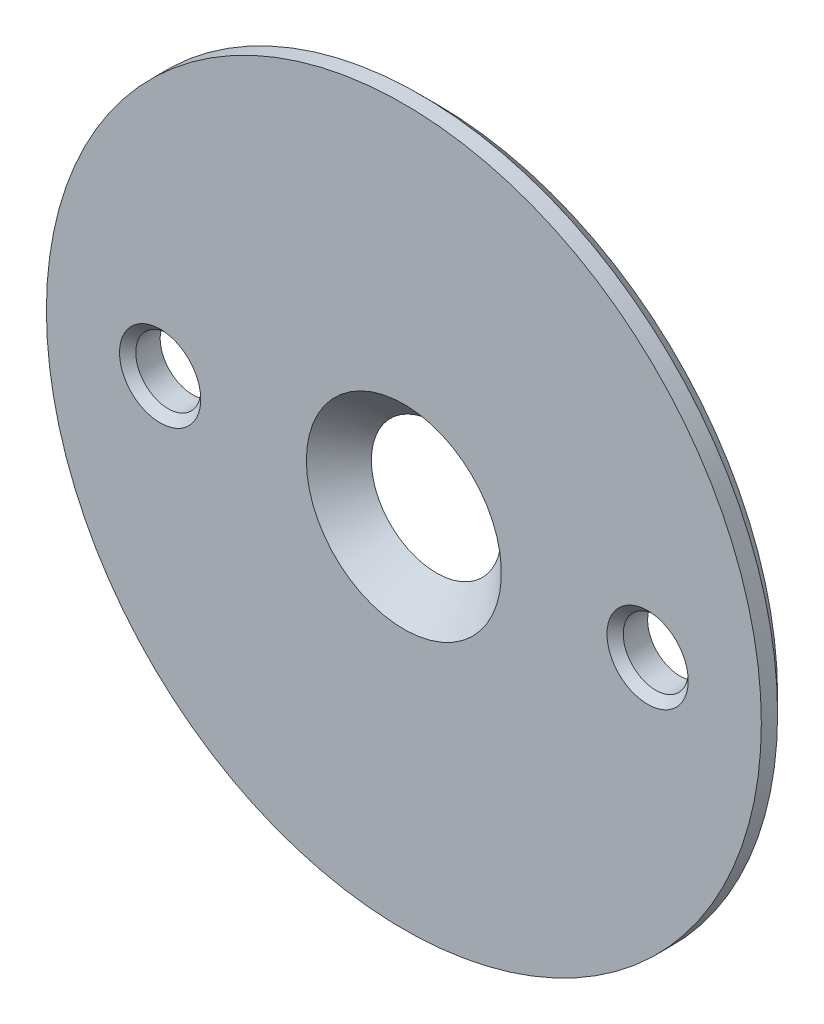
ISO-10303-21;
HEADER;
FILE_DESCRIPTION(('STEP AP214'),'2;1');
FILE_NAME('part.step','',(''),(''),'','','');
FILE_SCHEMA(('AUTOMOTIVE_DESIGN { 1 0 10303 214 1 1 1 1 }'));
ENDSEC;
DATA;
#1=APPLICATION_CONTEXT('core data for automotive mechanical design processes');
#2=APPLICATION_PROTOCOL_DEFINITION('international standard','automotive_design',2000,#1);
#3=PRODUCT_CONTEXT('',#1,'mechanical');
#4=PRODUCT('Part','Part','',(#3));
#5=PRODUCT_RELATED_PRODUCT_CATEGORY('part','',(#4));
#6=PRODUCT_DEFINITION_FORMATION('','',#4);
#7=PRODUCT_DEFINITION_CONTEXT('part definition',#1,'design');
#8=PRODUCT_DEFINITION('design','',#6,#7);
#9=PRODUCT_DEFINITION_SHAPE('','',#8);
#10=(LENGTH_UNIT() NAMED_UNIT(*) SI_UNIT(.MILLI.,.METRE.));
#11=(NAMED_UNIT(*) PLANE_ANGLE_UNIT() SI_UNIT($,.RADIAN.));
#12=(NAMED_UNIT(*) SI_UNIT($,.STERADIAN.) SOLID_ANGLE_UNIT());
#13=UNCERTAINTY_MEASURE_WITH_UNIT(LENGTH_MEASURE(1.E-05),#10,'distance_accuracy_value','');
#14=(GEOMETRIC_REPRESENTATION_CONTEXT(3) GLOBAL_UNCERTAINTY_ASSIGNED_CONTEXT((#13)) GLOBAL_UNIT_ASSIGNED_CONTEXT((#10,
#11,#12)) REPRESENTATION_CONTEXT('',''));
#15=CARTESIAN_POINT('',(0.,0.,0.));
#16=DIRECTION('',(0.,0.,1.));
#17=DIRECTION('',(1.,0.,0.));
#18=AXIS2_PLACEMENT_3D('',#15,#16,#17);
#19=CARTESIAN_POINT('',(0.,0.,2.));
#20=DIRECTION('',(0.,0.,-1.));
#21=DIRECTION('',(0.,-1.,0.));
#22=AXIS2_PLACEMENT_3D('',#19,#20,#21);
#23=PLANE('',#22);
#24=CARTESIAN_POINT('',(-15.,0.,2.));
#25=DIRECTION('',(0.,0.,-1.));
#26=DIRECTION('',(1.,0.,0.));
#27=AXIS2_PLACEMENT_3D('',#24,#25,#26);
#28=CIRCLE('',#27,2.5);
#29=CARTESIAN_POINT('',(-17.5,0.,2.));
#30=VERTEX_POINT('',#29);
#31=EDGE_CURVE('E118',#30,#30,#28,.T.);
#32=ORIENTED_EDGE('',*,*,#31,.T.);
#33=EDGE_LOOP('',(#32));
#34=FACE_BOUND('',#33,.T.);
#35=CARTESIAN_POINT('',(15.,0.,2.));
#36=DIRECTION('',(0.,0.,-1.));
#37=DIRECTION('',(1.,0.,0.));
#38=AXIS2_PLACEMENT_3D('',#35,#36,#37);
#39=CIRCLE('',#38,2.5);
#40=CARTESIAN_POINT('',(12.5,0.,2.));
#41=VERTEX_POINT('',#40);
#42=EDGE_CURVE('E126',#41,#41,#39,.T.);
#43=ORIENTED_EDGE('',*,*,#42,.T.);
#44=EDGE_LOOP('',(#43));
#45=FACE_BOUND('',#44,.T.);
#46=CARTESIAN_POINT('',(0.,0.,2.));
#47=DIRECTION('',(0.,0.,-1.));
#48=DIRECTION('',(1.,0.,0.));
#49=AXIS2_PLACEMENT_3D('',#46,#47,#48);
#50=CIRCLE('',#49,6.);
#51=CARTESIAN_POINT('',(-6.,0.,2.));
#52=VERTEX_POINT('',#51);
#53=EDGE_CURVE('E51',#52,#52,#50,.T.);
#54=ORIENTED_EDGE('',*,*,#53,.T.);
#55=EDGE_LOOP('',(#54));
#56=FACE_BOUND('',#55,.T.);
#57=CARTESIAN_POINT('',(0.,0.,2.));
#58=DIRECTION('',(0.,0.,-1.));
#59=DIRECTION('',(-1.,0.,0.));
#60=AXIS2_PLACEMENT_3D('',#57,#58,#59);
#61=CIRCLE('',#60,22.);
#62=CARTESIAN_POINT('',(22.,0.,2.));
#63=VERTEX_POINT('',#62);
#64=EDGE_CURVE('E26',#63,#63,#61,.T.);
#65=ORIENTED_EDGE('',*,*,#64,.F.);
#66=EDGE_LOOP('',(#65));
#67=FACE_BOUND('',#66,.T.);
#68=ADVANCED_FACE('F17',(#34,#45,#56,#67),#23,.F.);
#69=CARTESIAN_POINT('',(0.,0.,0.));
#70=DIRECTION('',(0.,0.,-1.));
#71=DIRECTION('',(0.,-1.,0.));
#72=AXIS2_PLACEMENT_3D('',#69,#70,#71);
#73=PLANE('',#72);
#74=CARTESIAN_POINT('',(-15.,0.,0.));
#75=DIRECTION('',(0.,0.,1.));
#76=DIRECTION('',(1.,0.,0.));
#77=AXIS2_PLACEMENT_3D('',#74,#75,#76);
#78=CIRCLE('',#77,2.);
#79=CARTESIAN_POINT('',(-17.,0.,0.));
#80=VERTEX_POINT('',#79);
#81=EDGE_CURVE('E113',#80,#80,#78,.T.);
#82=ORIENTED_EDGE('',*,*,#81,.T.);
#83=EDGE_LOOP('',(#82));
#84=FACE_BOUND('',#83,.T.);
#85=CARTESIAN_POINT('',(15.,0.,0.));
#86=DIRECTION('',(0.,0.,1.));
#87=DIRECTION('',(1.,0.,0.));
#88=AXIS2_PLACEMENT_3D('',#85,#86,#87);
#89=CIRCLE('',#88,2.);
#90=CARTESIAN_POINT('',(13.,0.,0.));
#91=VERTEX_POINT('',#90);
#92=EDGE_CURVE('E129',#91,#91,#89,.T.);
#93=ORIENTED_EDGE('',*,*,#92,.T.);
#94=EDGE_LOOP('',(#93));
#95=FACE_BOUND('',#94,.T.);
#96=CARTESIAN_POINT('',(0.,0.,0.));
#97=DIRECTION('',(0.,0.,1.));
#98=DIRECTION('',(1.,0.,0.));
#99=AXIS2_PLACEMENT_3D('',#96,#97,#98);
#100=CIRCLE('',#99,4.);
#101=CARTESIAN_POINT('',(-4.,0.,0.));
#102=VERTEX_POINT('',#101);
#103=EDGE_CURVE('E169',#102,#102,#100,.T.);
#104=ORIENTED_EDGE('',*,*,#103,.T.);
#105=EDGE_LOOP('',(#104));
#106=FACE_BOUND('',#105,.T.);
#107=CARTESIAN_POINT('',(0.,0.,0.));
#108=DIRECTION('',(0.,0.,1.));
#109=DIRECTION('',(-1.,0.,0.));
#110=AXIS2_PLACEMENT_3D('',#107,#108,#109);
#111=CIRCLE('',#110,21.);
#112=CARTESIAN_POINT('',(21.,0.,0.));
#113=VERTEX_POINT('',#112);
#114=EDGE_CURVE('E99',#113,#113,#111,.T.);
#115=ORIENTED_EDGE('',*,*,#114,.F.);
#116=EDGE_LOOP('',(#115));
#117=FACE_BOUND('',#116,.T.);
#118=ADVANCED_FACE('F219',(#84,#95,#106,#117),#73,.T.);
#119=CARTESIAN_POINT('',(0.,0.,0.));
#120=DIRECTION('',(0.,0.,1.));
#121=DIRECTION('',(-1.,0.,0.));
#122=AXIS2_PLACEMENT_3D('',#119,#120,#121);
#123=CYLINDRICAL_SURFACE('',#122,22.);
#124=ORIENTED_EDGE('',*,*,#64,.T.);
#125=DIRECTION('',(0.,0.,-1.));
#126=VECTOR('',#125,1.);
#127=CARTESIAN_POINT('',(22.,0.,0.));
#128=LINE('',#127,#126);
#129=CARTESIAN_POINT('',(22.,0.,1.));
#130=VERTEX_POINT('',#129);
#131=EDGE_CURVE('E11',#63,#130,#128,.T.);
#132=ORIENTED_EDGE('',*,*,#131,.T.);
#133=CARTESIAN_POINT('',(0.,0.,1.));
#134=DIRECTION('',(0.,0.,-1.));
#135=DIRECTION('',(-1.,0.,0.));
#136=AXIS2_PLACEMENT_3D('',#133,#134,#135);
#137=CIRCLE('',#136,22.);
#138=EDGE_CURVE('E92',#130,#130,#137,.T.);
#139=ORIENTED_EDGE('',*,*,#138,.F.);
#140=ORIENTED_EDGE('',*,*,#131,.F.);
#141=EDGE_LOOP('',(#124,#132,#139,#140));
#142=FACE_BOUND('',#141,.T.);
#143=ADVANCED_FACE('F90',(#142),#123,.T.);
#144=CARTESIAN_POINT('',(0.,0.,0.5));
#145=DIRECTION('',(0.,0.,1.));
#146=DIRECTION('',(-1.,0.,0.));
#147=AXIS2_PLACEMENT_3D('',#144,#145,#146);
#148=CONICAL_SURFACE('',#147,21.5,0.785398163397449);
#149=ORIENTED_EDGE('',*,*,#138,.T.);
#150=DIRECTION('',(-0.707106781186548,0.,-0.707106781186547));
#151=VECTOR('',#150,1.);
#152=CARTESIAN_POINT('',(21.5,0.,0.5));
#153=LINE('',#152,#151);
#154=EDGE_CURVE('E96',#130,#113,#153,.T.);
#155=ORIENTED_EDGE('',*,*,#154,.T.);
#156=ORIENTED_EDGE('',*,*,#114,.T.);
#157=ORIENTED_EDGE('',*,*,#154,.F.);
#158=EDGE_LOOP('',(#149,#155,#156,#157));
#159=FACE_BOUND('',#158,.T.);
#160=ADVANCED_FACE('F97',(#159),#148,.T.);
#161=CARTESIAN_POINT('',(-15.,0.,-60.2575296650935));
#162=DIRECTION('',(0.,0.,1.));
#163=DIRECTION('',(1.,0.,0.));
#164=AXIS2_PLACEMENT_3D('',#161,#162,#163);
#165=CYLINDRICAL_SURFACE('',#164,2.);
#166=ORIENTED_EDGE('',*,*,#81,.F.);
#167=DIRECTION('',(0.,0.,1.));
#168=VECTOR('',#167,1.);
#169=CARTESIAN_POINT('',(-17.,0.,-60.2575296650935));
#170=LINE('',#169,#168);
#171=CARTESIAN_POINT('',(-17.,0.,1.5));
#172=VERTEX_POINT('',#171);
#173=EDGE_CURVE('E85',#80,#172,#170,.T.);
#174=ORIENTED_EDGE('',*,*,#173,.T.);
#175=CARTESIAN_POINT('',(-15.,0.,1.5));
#176=DIRECTION('',(0.,0.,1.));
#177=DIRECTION('',(1.,0.,0.));
#178=AXIS2_PLACEMENT_3D('',#175,#176,#177);
#179=CIRCLE('',#178,2.);
#180=EDGE_CURVE('E152',#172,#172,#179,.T.);
#181=ORIENTED_EDGE('',*,*,#180,.T.);
#182=ORIENTED_EDGE('',*,*,#173,.F.);
#183=EDGE_LOOP('',(#166,#174,#181,#182));
#184=FACE_BOUND('',#183,.T.);
#185=ADVANCED_FACE('F241',(#184),#165,.F.);
#186=CARTESIAN_POINT('',(-15.,0.,1.75));
#187=DIRECTION('',(0.,0.,1.));
#188=DIRECTION('',(1.,0.,0.));
#189=AXIS2_PLACEMENT_3D('',#186,#187,#188);
#190=CONICAL_SURFACE('',#189,2.25,0.785398163397448);
#191=ORIENTED_EDGE('',*,*,#180,.F.);
#192=DIRECTION('',(-0.707106781186547,0.,0.707106781186548));
#193=VECTOR('',#192,1.);
#194=CARTESIAN_POINT('',(-17.25,0.,1.75));
#195=LINE('',#194,#193);
#196=EDGE_CURVE('E110',#172,#30,#195,.T.);
#197=ORIENTED_EDGE('',*,*,#196,.T.);
#198=ORIENTED_EDGE('',*,*,#31,.F.);
#199=ORIENTED_EDGE('',*,*,#196,.F.);
#200=EDGE_LOOP('',(#191,#197,#198,#199));
#201=FACE_BOUND('',#200,.T.);
#202=ADVANCED_FACE('F246',(#201),#190,.F.);
#203=CARTESIAN_POINT('',(15.,0.,-60.2575296650935));
#204=DIRECTION('',(0.,0.,1.));
#205=DIRECTION('',(1.,0.,0.));
#206=AXIS2_PLACEMENT_3D('',#203,#204,#205);
#207=CYLINDRICAL_SURFACE('',#206,2.);
#208=ORIENTED_EDGE('',*,*,#92,.F.);
#209=DIRECTION('',(0.,0.,1.));
#210=VECTOR('',#209,1.);
#211=CARTESIAN_POINT('',(13.,0.,-60.2575296650935));
#212=LINE('',#211,#210);
#213=CARTESIAN_POINT('',(13.,0.,1.5));
#214=VERTEX_POINT('',#213);
#215=EDGE_CURVE('E138',#91,#214,#212,.T.);
#216=ORIENTED_EDGE('',*,*,#215,.T.);
#217=CARTESIAN_POINT('',(15.,0.,1.5));
#218=DIRECTION('',(0.,0.,1.));
#219=DIRECTION('',(1.,0.,0.));
#220=AXIS2_PLACEMENT_3D('',#217,#218,#219);
#221=CIRCLE('',#220,2.);
#222=EDGE_CURVE('E141',#214,#214,#221,.T.);
#223=ORIENTED_EDGE('',*,*,#222,.T.);
#224=ORIENTED_EDGE('',*,*,#215,.F.);
#225=EDGE_LOOP('',(#208,#216,#223,#224));
#226=FACE_BOUND('',#225,.T.);
#227=ADVANCED_FACE('F234',(#226),#207,.F.);
#228=CARTESIAN_POINT('',(15.,0.,1.75));
#229=DIRECTION('',(0.,0.,1.));
#230=DIRECTION('',(1.,0.,0.));
#231=AXIS2_PLACEMENT_3D('',#228,#229,#230);
#232=CONICAL_SURFACE('',#231,2.25,0.785398163397448);
#233=ORIENTED_EDGE('',*,*,#222,.F.);
#234=DIRECTION('',(-0.707106781186547,0.,0.707106781186548));
#235=VECTOR('',#234,1.);
#236=CARTESIAN_POINT('',(12.75,0.,1.75));
#237=LINE('',#236,#235);
#238=EDGE_CURVE('E130',#214,#41,#237,.T.);
#239=ORIENTED_EDGE('',*,*,#238,.T.);
#240=ORIENTED_EDGE('',*,*,#42,.F.);
#241=ORIENTED_EDGE('',*,*,#238,.F.);
#242=EDGE_LOOP('',(#233,#239,#240,#241));
#243=FACE_BOUND('',#242,.T.);
#244=ADVANCED_FACE('F211',(#243),#232,.F.);
#245=CARTESIAN_POINT('',(0.,0.,0.25));
#246=DIRECTION('',(0.,0.,1.));
#247=DIRECTION('',(1.,0.,0.));
#248=AXIS2_PLACEMENT_3D('',#245,#246,#247);
#249=CONICAL_SURFACE('',#248,4.25,0.785398163397448);
#250=ORIENTED_EDGE('',*,*,#103,.F.);
#251=DIRECTION('',(-0.707106781186547,0.,0.707106781186548));
#252=VECTOR('',#251,1.);
#253=CARTESIAN_POINT('',(-4.25,0.,0.25));
#254=LINE('',#253,#252);
#255=EDGE_CURVE('E63',#102,#52,#254,.T.);
#256=ORIENTED_EDGE('',*,*,#255,.T.);
#257=ORIENTED_EDGE('',*,*,#53,.F.);
#258=ORIENTED_EDGE('',*,*,#255,.F.);
#259=EDGE_LOOP('',(#250,#256,#257,#258));
#260=FACE_BOUND('',#259,.T.);
#261=ADVANCED_FACE('F205',(#260),#249,.F.);
#262=CLOSED_SHELL('',(#68,#118,#143,#160,#185,#202,#227,#244,#261));
#263=MANIFOLD_SOLID_BREP('B1',#262);
#264=ADVANCED_BREP_SHAPE_REPRESENTATION('',(#18,#263),#14);
#265=SHAPE_DEFINITION_REPRESENTATION(#9,#264);
ENDSEC;
END-ISO-10303-21;
